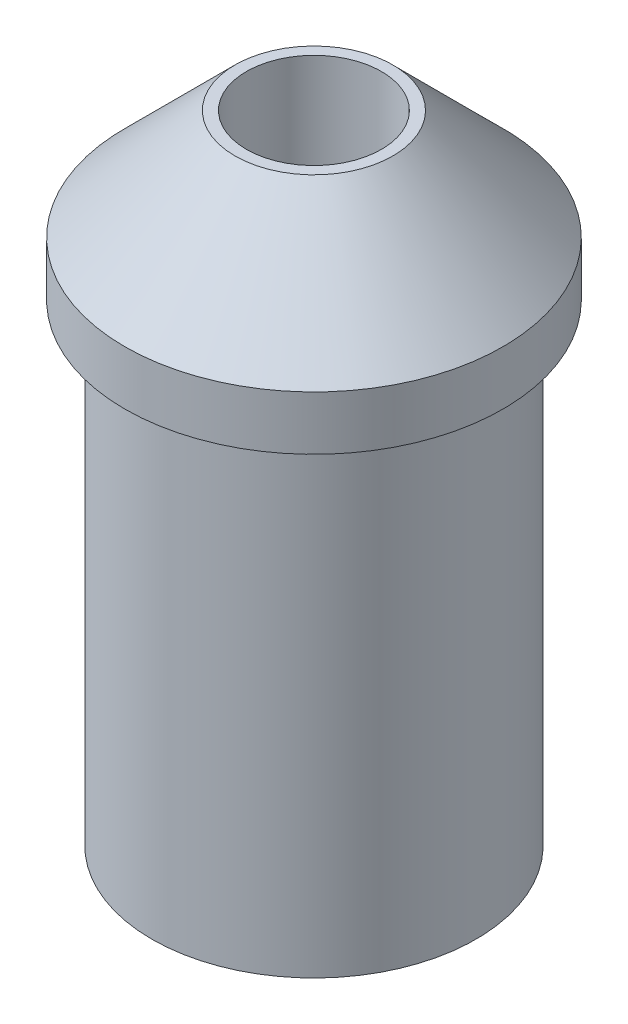
ISO-10303-21;
HEADER;
FILE_DESCRIPTION(('STEP AP214'),'2;1');
FILE_NAME('part.step','',(''),(''),'','','');
FILE_SCHEMA(('AUTOMOTIVE_DESIGN { 1 0 10303 214 1 1 1 1 }'));
ENDSEC;
DATA;
#1=APPLICATION_CONTEXT('core data for automotive mechanical design processes');
#2=APPLICATION_PROTOCOL_DEFINITION('international standard','automotive_design',2000,#1);
#3=PRODUCT_CONTEXT('',#1,'mechanical');
#4=PRODUCT('Part','Part','',(#3));
#5=PRODUCT_RELATED_PRODUCT_CATEGORY('part','',(#4));
#6=PRODUCT_DEFINITION_FORMATION('','',#4);
#7=PRODUCT_DEFINITION_CONTEXT('part definition',#1,'design');
#8=PRODUCT_DEFINITION('design','',#6,#7);
#9=PRODUCT_DEFINITION_SHAPE('','',#8);
#10=(LENGTH_UNIT() NAMED_UNIT(*) SI_UNIT(.MILLI.,.METRE.));
#11=(NAMED_UNIT(*) PLANE_ANGLE_UNIT() SI_UNIT($,.RADIAN.));
#12=(NAMED_UNIT(*) SI_UNIT($,.STERADIAN.) SOLID_ANGLE_UNIT());
#13=UNCERTAINTY_MEASURE_WITH_UNIT(LENGTH_MEASURE(1.E-05),#10,'distance_accuracy_value','');
#14=(GEOMETRIC_REPRESENTATION_CONTEXT(3) GLOBAL_UNCERTAINTY_ASSIGNED_CONTEXT((#13)) GLOBAL_UNIT_ASSIGNED_CONTEXT((#10,
#11,#12)) REPRESENTATION_CONTEXT('',''));
#15=CARTESIAN_POINT('',(0.,0.,0.));
#16=DIRECTION('',(0.,0.,1.));
#17=DIRECTION('',(1.,0.,0.));
#18=AXIS2_PLACEMENT_3D('',#15,#16,#17);
#19=CARTESIAN_POINT('',(0.,-8.75,0.));
#20=DIRECTION('',(0.,1.,0.));
#21=DIRECTION('',(0.,0.,1.));
#22=AXIS2_PLACEMENT_3D('',#19,#20,#21);
#23=CYLINDRICAL_SURFACE('',#22,3.);
#24=CARTESIAN_POINT('',(0.,-8.75,0.));
#25=DIRECTION('',(0.,1.,0.));
#26=DIRECTION('',(0.,0.,1.));
#27=AXIS2_PLACEMENT_3D('',#24,#25,#26);
#28=CIRCLE('',#27,3.);
#29=CARTESIAN_POINT('',(0.,-8.75,3.));
#30=VERTEX_POINT('',#29);
#31=EDGE_CURVE('E36',#30,#30,#28,.T.);
#32=ORIENTED_EDGE('',*,*,#31,.T.);
#33=EDGE_LOOP('',(#32));
#34=FACE_BOUND('',#33,.T.);
#35=CARTESIAN_POINT('',(0.,0.,0.));
#36=DIRECTION('',(0.,1.,0.));
#37=DIRECTION('',(0.,0.,1.));
#38=AXIS2_PLACEMENT_3D('',#35,#36,#37);
#39=CIRCLE('',#38,3.);
#40=CARTESIAN_POINT('',(0.,0.,3.));
#41=VERTEX_POINT('',#40);
#42=EDGE_CURVE('E40',#41,#41,#39,.T.);
#43=ORIENTED_EDGE('',*,*,#42,.F.);
#44=EDGE_LOOP('',(#43));
#45=FACE_BOUND('',#44,.T.);
#46=ADVANCED_FACE('F30',(#34,#45),#23,.T.);
#47=CARTESIAN_POINT('',(0.,-8.75,0.));
#48=DIRECTION('',(0.,1.,0.));
#49=DIRECTION('',(0.,0.,1.));
#50=AXIS2_PLACEMENT_3D('',#47,#48,#49);
#51=PLANE('',#50);
#52=ORIENTED_EDGE('',*,*,#31,.F.);
#53=EDGE_LOOP('',(#52));
#54=FACE_BOUND('',#53,.T.);
#55=ADVANCED_FACE('F76',(#54),#51,.F.);
#56=CARTESIAN_POINT('',(0.,1.,0.));
#57=DIRECTION('',(0.,-1.,0.));
#58=DIRECTION('',(0.,0.,-1.));
#59=AXIS2_PLACEMENT_3D('',#56,#57,#58);
#60=CYLINDRICAL_SURFACE('',#59,3.5);
#61=CARTESIAN_POINT('',(0.,1.,0.));
#62=DIRECTION('',(0.,1.,0.));
#63=DIRECTION('',(0.,0.,1.));
#64=AXIS2_PLACEMENT_3D('',#61,#62,#63);
#65=CIRCLE('',#64,3.5);
#66=CARTESIAN_POINT('',(0.,1.,3.5));
#67=VERTEX_POINT('',#66);
#68=EDGE_CURVE('E45',#67,#67,#65,.T.);
#69=ORIENTED_EDGE('',*,*,#68,.F.);
#70=EDGE_LOOP('',(#69));
#71=FACE_BOUND('',#70,.T.);
#72=CARTESIAN_POINT('',(0.,0.,0.));
#73=DIRECTION('',(0.,1.,0.));
#74=DIRECTION('',(0.,0.,1.));
#75=AXIS2_PLACEMENT_3D('',#72,#73,#74);
#76=CIRCLE('',#75,3.5);
#77=CARTESIAN_POINT('',(0.,0.,3.5));
#78=VERTEX_POINT('',#77);
#79=EDGE_CURVE('E47',#78,#78,#76,.T.);
#80=ORIENTED_EDGE('',*,*,#79,.T.);
#81=EDGE_LOOP('',(#80));
#82=FACE_BOUND('',#81,.T.);
#83=ADVANCED_FACE('F80',(#71,#82),#60,.T.);
#84=CARTESIAN_POINT('',(0.,0.,0.));
#85=DIRECTION('',(0.,1.,0.));
#86=DIRECTION('',(0.,0.,1.));
#87=AXIS2_PLACEMENT_3D('',#84,#85,#86);
#88=PLANE('',#87);
#89=ORIENTED_EDGE('',*,*,#42,.T.);
#90=EDGE_LOOP('',(#89));
#91=FACE_BOUND('',#90,.T.);
#92=ORIENTED_EDGE('',*,*,#79,.F.);
#93=EDGE_LOOP('',(#92));
#94=FACE_BOUND('',#93,.T.);
#95=ADVANCED_FACE('F85',(#91,#94),#88,.F.);
#96=CARTESIAN_POINT('',(0.,3.03887026310692,0.));
#97=DIRECTION('',(0.,1.,0.));
#98=DIRECTION('',(0.,0.,1.));
#99=AXIS2_PLACEMENT_3D('',#96,#97,#98);
#100=CYLINDRICAL_SURFACE('',#99,1.25);
#101=CARTESIAN_POINT('',(0.,3.03887026310692,0.));
#102=DIRECTION('',(0.,1.,0.));
#103=DIRECTION('',(0.,0.,1.));
#104=AXIS2_PLACEMENT_3D('',#101,#102,#103);
#105=CIRCLE('',#104,1.25);
#106=CARTESIAN_POINT('',(0.,3.03887026310692,1.25));
#107=VERTEX_POINT('',#106);
#108=EDGE_CURVE('E50',#107,#107,#105,.T.);
#109=ORIENTED_EDGE('',*,*,#108,.T.);
#110=EDGE_LOOP('',(#109));
#111=FACE_BOUND('',#110,.T.);
#112=CARTESIAN_POINT('',(0.,1.,0.));
#113=DIRECTION('',(0.,1.,0.));
#114=DIRECTION('',(0.,0.,1.));
#115=AXIS2_PLACEMENT_3D('',#112,#113,#114);
#116=CIRCLE('',#115,1.25);
#117=CARTESIAN_POINT('',(0.,1.,1.25));
#118=VERTEX_POINT('',#117);
#119=EDGE_CURVE('E10',#118,#118,#116,.F.);
#120=ORIENTED_EDGE('',*,*,#119,.T.);
#121=EDGE_LOOP('',(#120));
#122=FACE_BOUND('',#121,.T.);
#123=ADVANCED_FACE('F73',(#111,#122),#100,.F.);
#124=CARTESIAN_POINT('',(-1.46112973689306,3.03887026310692,0.));
#125=DIRECTION('',(0.,1.,0.));
#126=DIRECTION('',(0.,0.,1.));
#127=AXIS2_PLACEMENT_3D('',#124,#125,#126);
#128=PLANE('',#127);
#129=CARTESIAN_POINT('',(0.,3.03887026310692,0.));
#130=DIRECTION('',(0.,1.,0.));
#131=DIRECTION('',(0.,0.,1.));
#132=AXIS2_PLACEMENT_3D('',#129,#130,#131);
#133=CIRCLE('',#132,1.46112973689306);
#134=CARTESIAN_POINT('',(0.,3.03887026310692,1.46112973689306));
#135=VERTEX_POINT('',#134);
#136=EDGE_CURVE('E55',#135,#135,#133,.T.);
#137=ORIENTED_EDGE('',*,*,#136,.T.);
#138=EDGE_LOOP('',(#137));
#139=FACE_BOUND('',#138,.T.);
#140=ORIENTED_EDGE('',*,*,#108,.F.);
#141=EDGE_LOOP('',(#140));
#142=FACE_BOUND('',#141,.T.);
#143=ADVANCED_FACE('F59',(#139,#142),#128,.T.);
#144=CARTESIAN_POINT('',(0.,3.03887026310692,0.));
#145=DIRECTION('',(0.,-1.,0.));
#146=DIRECTION('',(0.,0.,-1.));
#147=AXIS2_PLACEMENT_3D('',#144,#145,#146);
#148=CONICAL_SURFACE('',#147,1.46112973689306,0.785398163397453);
#149=ORIENTED_EDGE('',*,*,#68,.T.);
#150=EDGE_LOOP('',(#149));
#151=FACE_BOUND('',#150,.T.);
#152=ORIENTED_EDGE('',*,*,#136,.F.);
#153=EDGE_LOOP('',(#152));
#154=FACE_BOUND('',#153,.T.);
#155=ADVANCED_FACE('F62',(#151,#154),#148,.T.);
#156=CARTESIAN_POINT('',(0.,1.,0.));
#157=DIRECTION('',(0.,1.,0.));
#158=DIRECTION('',(0.,0.,1.));
#159=AXIS2_PLACEMENT_3D('',#156,#157,#158);
#160=PLANE('',#159);
#161=ORIENTED_EDGE('',*,*,#119,.F.);
#162=EDGE_LOOP('',(#161));
#163=FACE_BOUND('',#162,.T.);
#164=ADVANCED_FACE('F64',(#163),#160,.T.);
#165=CLOSED_SHELL('',(#46,#55,#83,#95,#123,#143,#155,#164));
#166=MANIFOLD_SOLID_BREP('B2',#165);
#167=ADVANCED_BREP_SHAPE_REPRESENTATION('',(#18,#166),#14);
#168=SHAPE_DEFINITION_REPRESENTATION(#9,#167);
ENDSEC;
END-ISO-10303-21;
